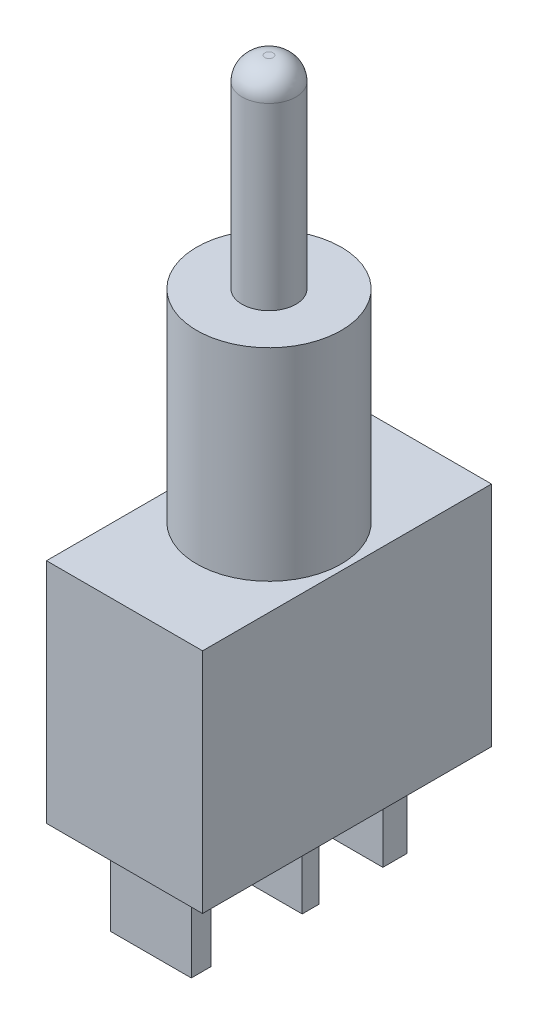
ISO-10303-21;
HEADER;
FILE_DESCRIPTION(('STEP AP214'),'2;1');
FILE_NAME('part.step','',(''),(''),'','','');
FILE_SCHEMA(('AUTOMOTIVE_DESIGN { 1 0 10303 214 1 1 1 1 }'));
ENDSEC;
DATA;
#1=APPLICATION_CONTEXT('core data for automotive mechanical design processes');
#2=APPLICATION_PROTOCOL_DEFINITION('international standard','automotive_design',2000,#1);
#3=PRODUCT_CONTEXT('',#1,'mechanical');
#4=PRODUCT('Part','Part','',(#3));
#5=PRODUCT_RELATED_PRODUCT_CATEGORY('part','',(#4));
#6=PRODUCT_DEFINITION_FORMATION('','',#4);
#7=PRODUCT_DEFINITION_CONTEXT('part definition',#1,'design');
#8=PRODUCT_DEFINITION('design','',#6,#7);
#9=PRODUCT_DEFINITION_SHAPE('','',#8);
#10=(LENGTH_UNIT() NAMED_UNIT(*) SI_UNIT(.MILLI.,.METRE.));
#11=(NAMED_UNIT(*) PLANE_ANGLE_UNIT() SI_UNIT($,.RADIAN.));
#12=(NAMED_UNIT(*) SI_UNIT($,.STERADIAN.) SOLID_ANGLE_UNIT());
#13=UNCERTAINTY_MEASURE_WITH_UNIT(LENGTH_MEASURE(1.E-05),#10,'distance_accuracy_value','');
#14=(GEOMETRIC_REPRESENTATION_CONTEXT(3) GLOBAL_UNCERTAINTY_ASSIGNED_CONTEXT((#13)) GLOBAL_UNIT_ASSIGNED_CONTEXT((#10,
#11,#12)) REPRESENTATION_CONTEXT('',''));
#15=CARTESIAN_POINT('',(0.,0.,0.));
#16=DIRECTION('',(0.,0.,1.));
#17=DIRECTION('',(1.,0.,0.));
#18=AXIS2_PLACEMENT_3D('',#15,#16,#17);
#19=CARTESIAN_POINT('',(0.,0.,0.));
#20=DIRECTION('',(0.,-1.,0.));
#21=DIRECTION('',(0.,0.,-1.));
#22=AXIS2_PLACEMENT_3D('',#19,#20,#21);
#23=PLANE('',#22);
#24=DIRECTION('',(0.,0.,1.));
#25=VECTOR('',#24,1.);
#26=CARTESIAN_POINT('',(0.,0.,0.));
#27=LINE('',#26,#25);
#28=CARTESIAN_POINT('',(0.,0.,-12.7));
#29=VERTEX_POINT('',#28);
#30=CARTESIAN_POINT('',(0.,0.,0.));
#31=VERTEX_POINT('',#30);
#32=EDGE_CURVE('E232',#29,#31,#27,.T.);
#33=ORIENTED_EDGE('',*,*,#32,.F.);
#34=DIRECTION('',(-1.,0.,0.));
#35=VECTOR('',#34,1.);
#36=CARTESIAN_POINT('',(0.,0.,-12.7));
#37=LINE('',#36,#35);
#38=CARTESIAN_POINT('',(6.86,0.,-12.7));
#39=VERTEX_POINT('',#38);
#40=EDGE_CURVE('E237',#39,#29,#37,.T.);
#41=ORIENTED_EDGE('',*,*,#40,.F.);
#42=DIRECTION('',(0.,0.,-1.));
#43=VECTOR('',#42,1.);
#44=CARTESIAN_POINT('',(6.86,0.,0.));
#45=LINE('',#44,#43);
#46=CARTESIAN_POINT('',(6.86,0.,0.));
#47=VERTEX_POINT('',#46);
#48=EDGE_CURVE('E248',#47,#39,#45,.T.);
#49=ORIENTED_EDGE('',*,*,#48,.F.);
#50=DIRECTION('',(1.,0.,0.));
#51=VECTOR('',#50,1.);
#52=CARTESIAN_POINT('',(0.,0.,0.));
#53=LINE('',#52,#51);
#54=EDGE_CURVE('E246',#31,#47,#53,.T.);
#55=ORIENTED_EDGE('',*,*,#54,.F.);
#56=EDGE_LOOP('',(#33,#41,#49,#55));
#57=FACE_BOUND('',#56,.T.);
#58=DIRECTION('',(1.,0.,0.));
#59=VECTOR('',#58,1.);
#60=CARTESIAN_POINT('',(1.51842921939957,0.,-6.90562990689449));
#61=LINE('',#60,#59);
#62=CARTESIAN_POINT('',(1.51842921939957,0.,-6.90562990689449));
#63=VERTEX_POINT('',#62);
#64=CARTESIAN_POINT('',(5.06630458819397,0.,-6.90562990689449));
#65=VERTEX_POINT('',#64);
#66=EDGE_CURVE('E217',#63,#65,#61,.T.);
#67=ORIENTED_EDGE('',*,*,#66,.F.);
#68=DIRECTION('',(0.,0.,-1.));
#69=VECTOR('',#68,1.);
#70=CARTESIAN_POINT('',(1.51842921939957,0.,-6.17158672714393));
#71=LINE('',#70,#69);
#72=CARTESIAN_POINT('',(1.51842921939957,0.,-6.17158672714393));
#73=VERTEX_POINT('',#72);
#74=EDGE_CURVE('E203',#73,#63,#71,.T.);
#75=ORIENTED_EDGE('',*,*,#74,.F.);
#76=DIRECTION('',(-1.,0.,0.));
#77=VECTOR('',#76,1.);
#78=CARTESIAN_POINT('',(1.51842921939957,0.,-6.17158672714393));
#79=LINE('',#78,#77);
#80=CARTESIAN_POINT('',(5.06630458819397,0.,-6.17158672714393));
#81=VERTEX_POINT('',#80);
#82=EDGE_CURVE('E208',#81,#73,#79,.T.);
#83=ORIENTED_EDGE('',*,*,#82,.F.);
#84=DIRECTION('',(0.,0.,1.));
#85=VECTOR('',#84,1.);
#86=CARTESIAN_POINT('',(5.06630458819397,0.,-6.17158672714393));
#87=LINE('',#86,#85);
#88=EDGE_CURVE('E219',#65,#81,#87,.T.);
#89=ORIENTED_EDGE('',*,*,#88,.F.);
#90=EDGE_LOOP('',(#67,#75,#83,#89));
#91=FACE_BOUND('',#90,.T.);
#92=DIRECTION('',(1.,0.,0.));
#93=VECTOR('',#92,1.);
#94=CARTESIAN_POINT('',(1.51842921939957,0.,-2.17512941516863));
#95=LINE('',#94,#93);
#96=CARTESIAN_POINT('',(1.51842921939957,0.,-2.17512941516863));
#97=VERTEX_POINT('',#96);
#98=CARTESIAN_POINT('',(5.06630458819397,0.,-2.17512941516863));
#99=VERTEX_POINT('',#98);
#100=EDGE_CURVE('E175',#97,#99,#95,.T.);
#101=ORIENTED_EDGE('',*,*,#100,.F.);
#102=DIRECTION('',(0.,0.,-1.));
#103=VECTOR('',#102,1.);
#104=CARTESIAN_POINT('',(1.51842921939957,0.,-1.29835561713323));
#105=LINE('',#104,#103);
#106=CARTESIAN_POINT('',(1.51842921939957,0.,-1.29835561713323));
#107=VERTEX_POINT('',#106);
#108=EDGE_CURVE('E172',#107,#97,#105,.T.);
#109=ORIENTED_EDGE('',*,*,#108,.F.);
#110=DIRECTION('',(-1.,0.,0.));
#111=VECTOR('',#110,1.);
#112=CARTESIAN_POINT('',(1.51842921939957,0.,-1.29835561713323));
#113=LINE('',#112,#111);
#114=CARTESIAN_POINT('',(5.06630458819397,0.,-1.29835561713323));
#115=VERTEX_POINT('',#114);
#116=EDGE_CURVE('E184',#115,#107,#113,.T.);
#117=ORIENTED_EDGE('',*,*,#116,.F.);
#118=DIRECTION('',(0.,0.,1.));
#119=VECTOR('',#118,1.);
#120=CARTESIAN_POINT('',(5.06630458819397,0.,-1.29835561713323));
#121=LINE('',#120,#119);
#122=EDGE_CURVE('E192',#99,#115,#121,.T.);
#123=ORIENTED_EDGE('',*,*,#122,.F.);
#124=EDGE_LOOP('',(#101,#109,#117,#123));
#125=FACE_BOUND('',#124,.T.);
#126=DIRECTION('',(1.,0.,0.));
#127=VECTOR('',#126,1.);
#128=CARTESIAN_POINT('',(1.51842921939957,0.,-10.7695516447482));
#129=LINE('',#128,#127);
#130=CARTESIAN_POINT('',(1.51842921939957,0.,-10.7695516447482));
#131=VERTEX_POINT('',#130);
#132=CARTESIAN_POINT('',(5.06630458819397,0.,-10.7695516447482));
#133=VERTEX_POINT('',#132);
#134=EDGE_CURVE('E406',#131,#133,#129,.T.);
#135=ORIENTED_EDGE('',*,*,#134,.F.);
#136=DIRECTION('',(0.,0.,-1.));
#137=VECTOR('',#136,1.);
#138=CARTESIAN_POINT('',(1.51842921939957,0.,-9.71946209593832));
#139=LINE('',#138,#137);
#140=CARTESIAN_POINT('',(1.51842921939957,0.,-9.71946209593832));
#141=VERTEX_POINT('',#140);
#142=EDGE_CURVE('E170',#141,#131,#139,.T.);
#143=ORIENTED_EDGE('',*,*,#142,.F.);
#144=DIRECTION('',(-1.,0.,0.));
#145=VECTOR('',#144,1.);
#146=CARTESIAN_POINT('',(1.51842921939957,0.,-9.71946209593832));
#147=LINE('',#146,#145);
#148=CARTESIAN_POINT('',(5.06630458819397,0.,-9.71946209593832));
#149=VERTEX_POINT('',#148);
#150=EDGE_CURVE('E166',#149,#141,#147,.T.);
#151=ORIENTED_EDGE('',*,*,#150,.F.);
#152=DIRECTION('',(0.,0.,1.));
#153=VECTOR('',#152,1.);
#154=CARTESIAN_POINT('',(5.06630458819397,0.,-9.71946209593832));
#155=LINE('',#154,#153);
#156=EDGE_CURVE('E408',#133,#149,#155,.T.);
#157=ORIENTED_EDGE('',*,*,#156,.F.);
#158=EDGE_LOOP('',(#135,#143,#151,#157));
#159=FACE_BOUND('',#158,.T.);
#160=ADVANCED_FACE('F33',(#57,#91,#125,#159),#23,.T.);
#161=CARTESIAN_POINT('',(0.,10.,0.));
#162=DIRECTION('',(1.,0.,0.));
#163=DIRECTION('',(0.,0.,-1.));
#164=AXIS2_PLACEMENT_3D('',#161,#162,#163);
#165=PLANE('',#164);
#166=ORIENTED_EDGE('',*,*,#32,.T.);
#167=DIRECTION('',(0.,-1.,0.));
#168=VECTOR('',#167,1.);
#169=CARTESIAN_POINT('',(0.,10.,0.));
#170=LINE('',#169,#168);
#171=CARTESIAN_POINT('',(0.,10.,0.));
#172=VERTEX_POINT('',#171);
#173=EDGE_CURVE('E259',#172,#31,#170,.T.);
#174=ORIENTED_EDGE('',*,*,#173,.F.);
#175=DIRECTION('',(0.,0.,1.));
#176=VECTOR('',#175,1.);
#177=CARTESIAN_POINT('',(0.,10.,0.));
#178=LINE('',#177,#176);
#179=CARTESIAN_POINT('',(0.,10.,-12.7));
#180=VERTEX_POINT('',#179);
#181=EDGE_CURVE('E233',#180,#172,#178,.T.);
#182=ORIENTED_EDGE('',*,*,#181,.F.);
#183=DIRECTION('',(0.,-1.,0.));
#184=VECTOR('',#183,1.);
#185=CARTESIAN_POINT('',(0.,10.,-12.7));
#186=LINE('',#185,#184);
#187=EDGE_CURVE('E243',#180,#29,#186,.T.);
#188=ORIENTED_EDGE('',*,*,#187,.T.);
#189=EDGE_LOOP('',(#166,#174,#182,#188));
#190=FACE_BOUND('',#189,.T.);
#191=ADVANCED_FACE('F278',(#190),#165,.F.);
#192=CARTESIAN_POINT('',(0.,10.,0.));
#193=DIRECTION('',(0.,0.,-1.));
#194=DIRECTION('',(-1.,0.,0.));
#195=AXIS2_PLACEMENT_3D('',#192,#193,#194);
#196=PLANE('',#195);
#197=ORIENTED_EDGE('',*,*,#54,.T.);
#198=DIRECTION('',(0.,-1.,0.));
#199=VECTOR('',#198,1.);
#200=CARTESIAN_POINT('',(6.86,10.,0.));
#201=LINE('',#200,#199);
#202=CARTESIAN_POINT('',(6.86,10.,0.));
#203=VERTEX_POINT('',#202);
#204=EDGE_CURVE('E256',#203,#47,#201,.T.);
#205=ORIENTED_EDGE('',*,*,#204,.F.);
#206=DIRECTION('',(1.,0.,0.));
#207=VECTOR('',#206,1.);
#208=CARTESIAN_POINT('',(0.,10.,0.));
#209=LINE('',#208,#207);
#210=EDGE_CURVE('E236',#172,#203,#209,.T.);
#211=ORIENTED_EDGE('',*,*,#210,.F.);
#212=ORIENTED_EDGE('',*,*,#173,.T.);
#213=EDGE_LOOP('',(#197,#205,#211,#212));
#214=FACE_BOUND('',#213,.T.);
#215=ADVANCED_FACE('F286',(#214),#196,.F.);
#216=CARTESIAN_POINT('',(6.86,10.,0.));
#217=DIRECTION('',(-1.,0.,0.));
#218=DIRECTION('',(0.,0.,1.));
#219=AXIS2_PLACEMENT_3D('',#216,#217,#218);
#220=PLANE('',#219);
#221=ORIENTED_EDGE('',*,*,#48,.T.);
#222=DIRECTION('',(0.,-1.,0.));
#223=VECTOR('',#222,1.);
#224=CARTESIAN_POINT('',(6.86,10.,-12.7));
#225=LINE('',#224,#223);
#226=CARTESIAN_POINT('',(6.86,10.,-12.7));
#227=VERTEX_POINT('',#226);
#228=EDGE_CURVE('E253',#227,#39,#225,.T.);
#229=ORIENTED_EDGE('',*,*,#228,.F.);
#230=DIRECTION('',(0.,0.,-1.));
#231=VECTOR('',#230,1.);
#232=CARTESIAN_POINT('',(6.86,10.,0.));
#233=LINE('',#232,#231);
#234=EDGE_CURVE('E239',#203,#227,#233,.T.);
#235=ORIENTED_EDGE('',*,*,#234,.F.);
#236=ORIENTED_EDGE('',*,*,#204,.T.);
#237=EDGE_LOOP('',(#221,#229,#235,#236));
#238=FACE_BOUND('',#237,.T.);
#239=ADVANCED_FACE('F297',(#238),#220,.F.);
#240=CARTESIAN_POINT('',(0.,10.,-12.7));
#241=DIRECTION('',(0.,0.,1.));
#242=DIRECTION('',(1.,0.,0.));
#243=AXIS2_PLACEMENT_3D('',#240,#241,#242);
#244=PLANE('',#243);
#245=ORIENTED_EDGE('',*,*,#40,.T.);
#246=ORIENTED_EDGE('',*,*,#187,.F.);
#247=DIRECTION('',(-1.,0.,0.));
#248=VECTOR('',#247,1.);
#249=CARTESIAN_POINT('',(0.,10.,-12.7));
#250=LINE('',#249,#248);
#251=EDGE_CURVE('E241',#227,#180,#250,.T.);
#252=ORIENTED_EDGE('',*,*,#251,.F.);
#253=ORIENTED_EDGE('',*,*,#228,.T.);
#254=EDGE_LOOP('',(#245,#246,#252,#253));
#255=FACE_BOUND('',#254,.T.);
#256=ADVANCED_FACE('F294',(#255),#244,.F.);
#257=CARTESIAN_POINT('',(0.,10.,0.));
#258=DIRECTION('',(0.,-1.,0.));
#259=DIRECTION('',(0.,0.,-1.));
#260=AXIS2_PLACEMENT_3D('',#257,#258,#259);
#261=PLANE('',#260);
#262=CARTESIAN_POINT('',(3.43,10.,-6.35));
#263=DIRECTION('',(0.,-1.,0.));
#264=DIRECTION('',(0.,0.,-1.));
#265=AXIS2_PLACEMENT_3D('',#262,#263,#264);
#266=CIRCLE('',#265,3.175);
#267=CARTESIAN_POINT('',(3.43,10.,-9.525));
#268=VERTEX_POINT('',#267);
#269=EDGE_CURVE('E262',#268,#268,#266,.F.);
#270=ORIENTED_EDGE('',*,*,#269,.F.);
#271=EDGE_LOOP('',(#270));
#272=FACE_BOUND('',#271,.T.);
#273=ORIENTED_EDGE('',*,*,#181,.T.);
#274=ORIENTED_EDGE('',*,*,#210,.T.);
#275=ORIENTED_EDGE('',*,*,#234,.T.);
#276=ORIENTED_EDGE('',*,*,#251,.T.);
#277=EDGE_LOOP('',(#273,#274,#275,#276));
#278=FACE_BOUND('',#277,.T.);
#279=ADVANCED_FACE('F292',(#272,#278),#261,.F.);
#280=CARTESIAN_POINT('',(1.51842921939957,-4.,-6.17158672714393));
#281=DIRECTION('',(1.,0.,0.));
#282=DIRECTION('',(0.,0.,-1.));
#283=AXIS2_PLACEMENT_3D('',#280,#281,#282);
#284=PLANE('',#283);
#285=ORIENTED_EDGE('',*,*,#74,.T.);
#286=DIRECTION('',(0.,1.,0.));
#287=VECTOR('',#286,1.);
#288=CARTESIAN_POINT('',(1.51842921939957,-4.,-6.90562990689449));
#289=LINE('',#288,#287);
#290=CARTESIAN_POINT('',(1.51842921939957,-4.,-6.90562990689449));
#291=VERTEX_POINT('',#290);
#292=EDGE_CURVE('E230',#291,#63,#289,.T.);
#293=ORIENTED_EDGE('',*,*,#292,.F.);
#294=DIRECTION('',(0.,0.,-1.));
#295=VECTOR('',#294,1.);
#296=CARTESIAN_POINT('',(1.51842921939957,-4.,-6.17158672714393));
#297=LINE('',#296,#295);
#298=CARTESIAN_POINT('',(1.51842921939957,-4.,-6.17158672714393));
#299=VERTEX_POINT('',#298);
#300=EDGE_CURVE('E204',#299,#291,#297,.T.);
#301=ORIENTED_EDGE('',*,*,#300,.F.);
#302=DIRECTION('',(0.,1.,0.));
#303=VECTOR('',#302,1.);
#304=CARTESIAN_POINT('',(1.51842921939957,-4.,-6.17158672714393));
#305=LINE('',#304,#303);
#306=EDGE_CURVE('E214',#299,#73,#305,.T.);
#307=ORIENTED_EDGE('',*,*,#306,.T.);
#308=EDGE_LOOP('',(#285,#293,#301,#307));
#309=FACE_BOUND('',#308,.T.);
#310=ADVANCED_FACE('F317',(#309),#284,.F.);
#311=CARTESIAN_POINT('',(1.51842921939957,-4.,-6.90562990689449));
#312=DIRECTION('',(0.,0.,1.));
#313=DIRECTION('',(1.,0.,0.));
#314=AXIS2_PLACEMENT_3D('',#311,#312,#313);
#315=PLANE('',#314);
#316=ORIENTED_EDGE('',*,*,#66,.T.);
#317=DIRECTION('',(0.,1.,0.));
#318=VECTOR('',#317,1.);
#319=CARTESIAN_POINT('',(5.06630458819397,-4.,-6.90562990689449));
#320=LINE('',#319,#318);
#321=CARTESIAN_POINT('',(5.06630458819397,-4.,-6.90562990689449));
#322=VERTEX_POINT('',#321);
#323=EDGE_CURVE('E227',#322,#65,#320,.T.);
#324=ORIENTED_EDGE('',*,*,#323,.F.);
#325=DIRECTION('',(1.,0.,0.));
#326=VECTOR('',#325,1.);
#327=CARTESIAN_POINT('',(1.51842921939957,-4.,-6.90562990689449));
#328=LINE('',#327,#326);
#329=EDGE_CURVE('E207',#291,#322,#328,.T.);
#330=ORIENTED_EDGE('',*,*,#329,.F.);
#331=ORIENTED_EDGE('',*,*,#292,.T.);
#332=EDGE_LOOP('',(#316,#324,#330,#331));
#333=FACE_BOUND('',#332,.T.);
#334=ADVANCED_FACE('F324',(#333),#315,.F.);
#335=CARTESIAN_POINT('',(5.06630458819397,-4.,-6.17158672714393));
#336=DIRECTION('',(-1.,0.,0.));
#337=DIRECTION('',(0.,0.,1.));
#338=AXIS2_PLACEMENT_3D('',#335,#336,#337);
#339=PLANE('',#338);
#340=ORIENTED_EDGE('',*,*,#88,.T.);
#341=DIRECTION('',(0.,1.,0.));
#342=VECTOR('',#341,1.);
#343=CARTESIAN_POINT('',(5.06630458819397,-4.,-6.17158672714393));
#344=LINE('',#343,#342);
#345=CARTESIAN_POINT('',(5.06630458819397,-4.,-6.17158672714393));
#346=VERTEX_POINT('',#345);
#347=EDGE_CURVE('E225',#346,#81,#344,.T.);
#348=ORIENTED_EDGE('',*,*,#347,.F.);
#349=DIRECTION('',(0.,0.,1.));
#350=VECTOR('',#349,1.);
#351=CARTESIAN_POINT('',(5.06630458819397,-4.,-6.17158672714393));
#352=LINE('',#351,#350);
#353=EDGE_CURVE('E210',#322,#346,#352,.T.);
#354=ORIENTED_EDGE('',*,*,#353,.F.);
#355=ORIENTED_EDGE('',*,*,#323,.T.);
#356=EDGE_LOOP('',(#340,#348,#354,#355));
#357=FACE_BOUND('',#356,.T.);
#358=ADVANCED_FACE('F380',(#357),#339,.F.);
#359=CARTESIAN_POINT('',(1.51842921939957,-4.,-6.17158672714393));
#360=DIRECTION('',(0.,0.,-1.));
#361=DIRECTION('',(-1.,0.,0.));
#362=AXIS2_PLACEMENT_3D('',#359,#360,#361);
#363=PLANE('',#362);
#364=ORIENTED_EDGE('',*,*,#82,.T.);
#365=ORIENTED_EDGE('',*,*,#306,.F.);
#366=DIRECTION('',(-1.,0.,0.));
#367=VECTOR('',#366,1.);
#368=CARTESIAN_POINT('',(1.51842921939957,-4.,-6.17158672714393));
#369=LINE('',#368,#367);
#370=EDGE_CURVE('E212',#346,#299,#369,.T.);
#371=ORIENTED_EDGE('',*,*,#370,.F.);
#372=ORIENTED_EDGE('',*,*,#347,.T.);
#373=EDGE_LOOP('',(#364,#365,#371,#372));
#374=FACE_BOUND('',#373,.T.);
#375=ADVANCED_FACE('F376',(#374),#363,.F.);
#376=CARTESIAN_POINT('',(0.,-4.,0.));
#377=DIRECTION('',(0.,-1.,0.));
#378=DIRECTION('',(0.,0.,-1.));
#379=AXIS2_PLACEMENT_3D('',#376,#377,#378);
#380=PLANE('',#379);
#381=ORIENTED_EDGE('',*,*,#300,.T.);
#382=ORIENTED_EDGE('',*,*,#329,.T.);
#383=ORIENTED_EDGE('',*,*,#353,.T.);
#384=ORIENTED_EDGE('',*,*,#370,.T.);
#385=EDGE_LOOP('',(#381,#382,#383,#384));
#386=FACE_BOUND('',#385,.T.);
#387=ADVANCED_FACE('F372',(#386),#380,.T.);
#388=CARTESIAN_POINT('',(1.51842921939957,-4.,-1.29835561713323));
#389=DIRECTION('',(1.,0.,0.));
#390=DIRECTION('',(0.,0.,-1.));
#391=AXIS2_PLACEMENT_3D('',#388,#389,#390);
#392=PLANE('',#391);
#393=ORIENTED_EDGE('',*,*,#108,.T.);
#394=DIRECTION('',(0.,1.,0.));
#395=VECTOR('',#394,1.);
#396=CARTESIAN_POINT('',(1.51842921939957,-4.,-2.17512941516863));
#397=LINE('',#396,#395);
#398=CARTESIAN_POINT('',(1.51842921939957,-4.,-2.17512941516863));
#399=VERTEX_POINT('',#398);
#400=EDGE_CURVE('E201',#399,#97,#397,.T.);
#401=ORIENTED_EDGE('',*,*,#400,.F.);
#402=DIRECTION('',(0.,0.,-1.));
#403=VECTOR('',#402,1.);
#404=CARTESIAN_POINT('',(1.51842921939957,-4.,-1.29835561713323));
#405=LINE('',#404,#403);
#406=CARTESIAN_POINT('',(1.51842921939957,-4.,-1.29835561713323));
#407=VERTEX_POINT('',#406);
#408=EDGE_CURVE('E180',#407,#399,#405,.T.);
#409=ORIENTED_EDGE('',*,*,#408,.F.);
#410=DIRECTION('',(0.,1.,0.));
#411=VECTOR('',#410,1.);
#412=CARTESIAN_POINT('',(1.51842921939957,-4.,-1.29835561713323));
#413=LINE('',#412,#411);
#414=EDGE_CURVE('E189',#407,#107,#413,.T.);
#415=ORIENTED_EDGE('',*,*,#414,.T.);
#416=EDGE_LOOP('',(#393,#401,#409,#415));
#417=FACE_BOUND('',#416,.T.);
#418=ADVANCED_FACE('F368',(#417),#392,.F.);
#419=CARTESIAN_POINT('',(1.51842921939957,-4.,-2.17512941516863));
#420=DIRECTION('',(0.,0.,1.));
#421=DIRECTION('',(1.,0.,0.));
#422=AXIS2_PLACEMENT_3D('',#419,#420,#421);
#423=PLANE('',#422);
#424=ORIENTED_EDGE('',*,*,#100,.T.);
#425=DIRECTION('',(0.,1.,0.));
#426=VECTOR('',#425,1.);
#427=CARTESIAN_POINT('',(5.06630458819397,-4.,-2.17512941516863));
#428=LINE('',#427,#426);
#429=CARTESIAN_POINT('',(5.06630458819397,-4.,-2.17512941516863));
#430=VERTEX_POINT('',#429);
#431=EDGE_CURVE('E198',#430,#99,#428,.T.);
#432=ORIENTED_EDGE('',*,*,#431,.F.);
#433=DIRECTION('',(1.,0.,0.));
#434=VECTOR('',#433,1.);
#435=CARTESIAN_POINT('',(1.51842921939957,-4.,-2.17512941516863));
#436=LINE('',#435,#434);
#437=EDGE_CURVE('E183',#399,#430,#436,.T.);
#438=ORIENTED_EDGE('',*,*,#437,.F.);
#439=ORIENTED_EDGE('',*,*,#400,.T.);
#440=EDGE_LOOP('',(#424,#432,#438,#439));
#441=FACE_BOUND('',#440,.T.);
#442=ADVANCED_FACE('F364',(#441),#423,.F.);
#443=CARTESIAN_POINT('',(5.06630458819397,-4.,-1.29835561713323));
#444=DIRECTION('',(-1.,0.,0.));
#445=DIRECTION('',(0.,0.,1.));
#446=AXIS2_PLACEMENT_3D('',#443,#444,#445);
#447=PLANE('',#446);
#448=ORIENTED_EDGE('',*,*,#122,.T.);
#449=DIRECTION('',(0.,1.,0.));
#450=VECTOR('',#449,1.);
#451=CARTESIAN_POINT('',(5.06630458819397,-4.,-1.29835561713323));
#452=LINE('',#451,#450);
#453=CARTESIAN_POINT('',(5.06630458819397,-4.,-1.29835561713323));
#454=VERTEX_POINT('',#453);
#455=EDGE_CURVE('E56',#454,#115,#452,.T.);
#456=ORIENTED_EDGE('',*,*,#455,.F.);
#457=DIRECTION('',(0.,0.,1.));
#458=VECTOR('',#457,1.);
#459=CARTESIAN_POINT('',(5.06630458819397,-4.,-1.29835561713323));
#460=LINE('',#459,#458);
#461=EDGE_CURVE('E186',#430,#454,#460,.T.);
#462=ORIENTED_EDGE('',*,*,#461,.F.);
#463=ORIENTED_EDGE('',*,*,#431,.T.);
#464=EDGE_LOOP('',(#448,#456,#462,#463));
#465=FACE_BOUND('',#464,.T.);
#466=ADVANCED_FACE('F361',(#465),#447,.F.);
#467=CARTESIAN_POINT('',(1.51842921939957,-4.,-1.29835561713323));
#468=DIRECTION('',(0.,0.,-1.));
#469=DIRECTION('',(-1.,0.,0.));
#470=AXIS2_PLACEMENT_3D('',#467,#468,#469);
#471=PLANE('',#470);
#472=ORIENTED_EDGE('',*,*,#116,.T.);
#473=ORIENTED_EDGE('',*,*,#414,.F.);
#474=DIRECTION('',(-1.,0.,0.));
#475=VECTOR('',#474,1.);
#476=CARTESIAN_POINT('',(1.51842921939957,-4.,-1.29835561713323));
#477=LINE('',#476,#475);
#478=EDGE_CURVE('E188',#454,#407,#477,.T.);
#479=ORIENTED_EDGE('',*,*,#478,.F.);
#480=ORIENTED_EDGE('',*,*,#455,.T.);
#481=EDGE_LOOP('',(#472,#473,#479,#480));
#482=FACE_BOUND('',#481,.T.);
#483=ADVANCED_FACE('F357',(#482),#471,.F.);
#484=CARTESIAN_POINT('',(0.,-4.,0.));
#485=DIRECTION('',(0.,-1.,0.));
#486=DIRECTION('',(0.,0.,-1.));
#487=AXIS2_PLACEMENT_3D('',#484,#485,#486);
#488=PLANE('',#487);
#489=ORIENTED_EDGE('',*,*,#408,.T.);
#490=ORIENTED_EDGE('',*,*,#437,.T.);
#491=ORIENTED_EDGE('',*,*,#461,.T.);
#492=ORIENTED_EDGE('',*,*,#478,.T.);
#493=EDGE_LOOP('',(#489,#490,#491,#492));
#494=FACE_BOUND('',#493,.T.);
#495=ADVANCED_FACE('F354',(#494),#488,.T.);
#496=CARTESIAN_POINT('',(1.51842921939957,-4.,-9.71946209593832));
#497=DIRECTION('',(1.,0.,0.));
#498=DIRECTION('',(0.,0.,-1.));
#499=AXIS2_PLACEMENT_3D('',#496,#497,#498);
#500=PLANE('',#499);
#501=ORIENTED_EDGE('',*,*,#142,.T.);
#502=DIRECTION('',(0.,1.,0.));
#503=VECTOR('',#502,1.);
#504=CARTESIAN_POINT('',(1.51842921939957,-4.,-10.7695516447482));
#505=LINE('',#504,#503);
#506=CARTESIAN_POINT('',(1.51842921939957,-4.,-10.7695516447482));
#507=VERTEX_POINT('',#506);
#508=EDGE_CURVE('E151',#507,#131,#505,.T.);
#509=ORIENTED_EDGE('',*,*,#508,.F.);
#510=DIRECTION('',(0.,0.,-1.));
#511=VECTOR('',#510,1.);
#512=CARTESIAN_POINT('',(1.51842921939957,-4.,-9.71946209593832));
#513=LINE('',#512,#511);
#514=CARTESIAN_POINT('',(1.51842921939957,-4.,-9.71946209593832));
#515=VERTEX_POINT('',#514);
#516=EDGE_CURVE('E158',#515,#507,#513,.T.);
#517=ORIENTED_EDGE('',*,*,#516,.F.);
#518=DIRECTION('',(0.,1.,0.));
#519=VECTOR('',#518,1.);
#520=CARTESIAN_POINT('',(1.51842921939957,-4.,-9.71946209593832));
#521=LINE('',#520,#519);
#522=EDGE_CURVE('E416',#515,#141,#521,.T.);
#523=ORIENTED_EDGE('',*,*,#522,.T.);
#524=EDGE_LOOP('',(#501,#509,#517,#523));
#525=FACE_BOUND('',#524,.T.);
#526=ADVANCED_FACE('F168',(#525),#500,.F.);
#527=CARTESIAN_POINT('',(1.51842921939957,-4.,-10.7695516447482));
#528=DIRECTION('',(0.,0.,1.));
#529=DIRECTION('',(1.,0.,0.));
#530=AXIS2_PLACEMENT_3D('',#527,#528,#529);
#531=PLANE('',#530);
#532=ORIENTED_EDGE('',*,*,#134,.T.);
#533=DIRECTION('',(0.,1.,0.));
#534=VECTOR('',#533,1.);
#535=CARTESIAN_POINT('',(5.06630458819397,-4.,-10.7695516447482));
#536=LINE('',#535,#534);
#537=CARTESIAN_POINT('',(5.06630458819397,-4.,-10.7695516447482));
#538=VERTEX_POINT('',#537);
#539=EDGE_CURVE('E154',#538,#133,#536,.T.);
#540=ORIENTED_EDGE('',*,*,#539,.F.);
#541=DIRECTION('',(1.,0.,0.));
#542=VECTOR('',#541,1.);
#543=CARTESIAN_POINT('',(1.51842921939957,-4.,-10.7695516447482));
#544=LINE('',#543,#542);
#545=EDGE_CURVE('E147',#507,#538,#544,.T.);
#546=ORIENTED_EDGE('',*,*,#545,.F.);
#547=ORIENTED_EDGE('',*,*,#508,.T.);
#548=EDGE_LOOP('',(#532,#540,#546,#547));
#549=FACE_BOUND('',#548,.T.);
#550=ADVANCED_FACE('F149',(#549),#531,.F.);
#551=CARTESIAN_POINT('',(5.06630458819397,-4.,-9.71946209593832));
#552=DIRECTION('',(-1.,0.,0.));
#553=DIRECTION('',(0.,0.,1.));
#554=AXIS2_PLACEMENT_3D('',#551,#552,#553);
#555=PLANE('',#554);
#556=ORIENTED_EDGE('',*,*,#156,.T.);
#557=DIRECTION('',(0.,1.,0.));
#558=VECTOR('',#557,1.);
#559=CARTESIAN_POINT('',(5.06630458819397,-4.,-9.71946209593832));
#560=LINE('',#559,#558);
#561=CARTESIAN_POINT('',(5.06630458819397,-4.,-9.71946209593832));
#562=VERTEX_POINT('',#561);
#563=EDGE_CURVE('E48',#562,#149,#560,.T.);
#564=ORIENTED_EDGE('',*,*,#563,.F.);
#565=DIRECTION('',(0.,0.,1.));
#566=VECTOR('',#565,1.);
#567=CARTESIAN_POINT('',(5.06630458819397,-4.,-9.71946209593832));
#568=LINE('',#567,#566);
#569=EDGE_CURVE('E157',#538,#562,#568,.T.);
#570=ORIENTED_EDGE('',*,*,#569,.F.);
#571=ORIENTED_EDGE('',*,*,#539,.T.);
#572=EDGE_LOOP('',(#556,#564,#570,#571));
#573=FACE_BOUND('',#572,.T.);
#574=ADVANCED_FACE('F346',(#573),#555,.F.);
#575=CARTESIAN_POINT('',(1.51842921939957,-4.,-9.71946209593832));
#576=DIRECTION('',(0.,0.,-1.));
#577=DIRECTION('',(-1.,0.,0.));
#578=AXIS2_PLACEMENT_3D('',#575,#576,#577);
#579=PLANE('',#578);
#580=ORIENTED_EDGE('',*,*,#150,.T.);
#581=ORIENTED_EDGE('',*,*,#522,.F.);
#582=DIRECTION('',(-1.,0.,0.));
#583=VECTOR('',#582,1.);
#584=CARTESIAN_POINT('',(1.51842921939957,-4.,-9.71946209593832));
#585=LINE('',#584,#583);
#586=EDGE_CURVE('E162',#562,#515,#585,.T.);
#587=ORIENTED_EDGE('',*,*,#586,.F.);
#588=ORIENTED_EDGE('',*,*,#563,.T.);
#589=EDGE_LOOP('',(#580,#581,#587,#588));
#590=FACE_BOUND('',#589,.T.);
#591=ADVANCED_FACE('F339',(#590),#579,.F.);
#592=CARTESIAN_POINT('',(0.,-4.,0.));
#593=DIRECTION('',(0.,-1.,0.));
#594=DIRECTION('',(0.,0.,-1.));
#595=AXIS2_PLACEMENT_3D('',#592,#593,#594);
#596=PLANE('',#595);
#597=ORIENTED_EDGE('',*,*,#516,.T.);
#598=ORIENTED_EDGE('',*,*,#545,.T.);
#599=ORIENTED_EDGE('',*,*,#569,.T.);
#600=ORIENTED_EDGE('',*,*,#586,.T.);
#601=EDGE_LOOP('',(#597,#598,#599,#600));
#602=FACE_BOUND('',#601,.T.);
#603=ADVANCED_FACE('F161',(#602),#596,.T.);
#604=CARTESIAN_POINT('',(3.43,18.89,-6.35));
#605=DIRECTION('',(0.,-1.,0.));
#606=DIRECTION('',(0.,0.,-1.));
#607=AXIS2_PLACEMENT_3D('',#604,#605,#606);
#608=CYLINDRICAL_SURFACE('',#607,3.175);
#609=CARTESIAN_POINT('',(3.43,18.89,-6.35));
#610=DIRECTION('',(0.,1.,0.));
#611=DIRECTION('',(0.,0.,1.));
#612=AXIS2_PLACEMENT_3D('',#609,#610,#611);
#613=CIRCLE('',#612,3.175);
#614=CARTESIAN_POINT('',(3.43,18.89,-9.525));
#615=VERTEX_POINT('',#614);
#616=EDGE_CURVE('E411',#615,#615,#613,.T.);
#617=CARTESIAN_POINT('',(3.43,18.89,-9.525));
#618=CARTESIAN_POINT('',(3.43,18.7973958333333,-9.525));
#619=CARTESIAN_POINT('',(3.43,18.7047916666667,-9.525));
#620=CARTESIAN_POINT('',(3.43,18.5195833333333,-9.525));
#621=CARTESIAN_POINT('',(3.43,18.4269791666667,-9.525));
#622=CARTESIAN_POINT('',(3.43,18.2417708333333,-9.525));
#623=CARTESIAN_POINT('',(3.43,18.1491666666667,-9.525));
#624=CARTESIAN_POINT('',(3.43,17.9639583333333,-9.525));
#625=CARTESIAN_POINT('',(3.43,17.8713541666667,-9.525));
#626=CARTESIAN_POINT('',(3.43,17.6861458333333,-9.525));
#627=CARTESIAN_POINT('',(3.43,17.5935416666667,-9.525));
#628=CARTESIAN_POINT('',(3.43,17.4083333333333,-9.525));
#629=CARTESIAN_POINT('',(3.43,17.3157291666667,-9.525));
#630=CARTESIAN_POINT('',(3.43,17.1305208333333,-9.525));
#631=CARTESIAN_POINT('',(3.43,17.0379166666667,-9.525));
#632=CARTESIAN_POINT('',(3.43,16.8527083333333,-9.525));
#633=CARTESIAN_POINT('',(3.43,16.7601041666667,-9.525));
#634=CARTESIAN_POINT('',(3.43,16.5748958333333,-9.525));
#635=CARTESIAN_POINT('',(3.43,16.4822916666667,-9.525));
#636=CARTESIAN_POINT('',(3.43,16.2970833333333,-9.525));
#637=CARTESIAN_POINT('',(3.43,16.2044791666667,-9.525));
#638=CARTESIAN_POINT('',(3.43,16.0192708333333,-9.525));
#639=CARTESIAN_POINT('',(3.43,15.9266666666667,-9.525));
#640=CARTESIAN_POINT('',(3.43,15.7414583333333,-9.525));
#641=CARTESIAN_POINT('',(3.43,15.6488541666667,-9.525));
#642=CARTESIAN_POINT('',(3.43,15.4636458333333,-9.525));
#643=CARTESIAN_POINT('',(3.43,15.3710416666667,-9.525));
#644=CARTESIAN_POINT('',(3.43,15.1858333333333,-9.525));
#645=CARTESIAN_POINT('',(3.43,15.0932291666667,-9.525));
#646=CARTESIAN_POINT('',(3.43,14.9080208333333,-9.525));
#647=CARTESIAN_POINT('',(3.43,14.8154166666667,-9.525));
#648=CARTESIAN_POINT('',(3.43,14.6302083333333,-9.525));
#649=CARTESIAN_POINT('',(3.43,14.5376041666667,-9.525));
#650=CARTESIAN_POINT('',(3.43,14.3523958333333,-9.525));
#651=CARTESIAN_POINT('',(3.43,14.2597916666667,-9.525));
#652=CARTESIAN_POINT('',(3.43,14.0745833333333,-9.525));
#653=CARTESIAN_POINT('',(3.43,13.9819791666667,-9.525));
#654=CARTESIAN_POINT('',(3.43,13.7967708333333,-9.525));
#655=CARTESIAN_POINT('',(3.43,13.7041666666667,-9.525));
#656=CARTESIAN_POINT('',(3.43,13.5189583333333,-9.525));
#657=CARTESIAN_POINT('',(3.43,13.4263541666667,-9.525));
#658=CARTESIAN_POINT('',(3.43,13.2411458333333,-9.525));
#659=CARTESIAN_POINT('',(3.43,13.1485416666667,-9.525));
#660=CARTESIAN_POINT('',(3.43,12.9633333333333,-9.525));
#661=CARTESIAN_POINT('',(3.43,12.8707291666667,-9.525));
#662=CARTESIAN_POINT('',(3.43,12.6855208333333,-9.525));
#663=CARTESIAN_POINT('',(3.43,12.5929166666667,-9.525));
#664=CARTESIAN_POINT('',(3.43,12.4077083333333,-9.525));
#665=CARTESIAN_POINT('',(3.43,12.3151041666667,-9.525));
#666=CARTESIAN_POINT('',(3.43,12.1298958333333,-9.525));
#667=CARTESIAN_POINT('',(3.43,12.0372916666667,-9.525));
#668=CARTESIAN_POINT('',(3.43,11.8520833333333,-9.525));
#669=CARTESIAN_POINT('',(3.43,11.7594791666667,-9.525));
#670=CARTESIAN_POINT('',(3.43,11.5742708333333,-9.525));
#671=CARTESIAN_POINT('',(3.43,11.4816666666667,-9.525));
#672=CARTESIAN_POINT('',(3.43,11.2964583333333,-9.525));
#673=CARTESIAN_POINT('',(3.43,11.2038541666667,-9.525));
#674=CARTESIAN_POINT('',(3.43,11.0186458333333,-9.525));
#675=CARTESIAN_POINT('',(3.43,10.9260416666667,-9.525));
#676=CARTESIAN_POINT('',(3.43,10.7408333333333,-9.525));
#677=CARTESIAN_POINT('',(3.43,10.6482291666667,-9.525));
#678=CARTESIAN_POINT('',(3.43,10.4630208333333,-9.525));
#679=CARTESIAN_POINT('',(3.43,10.3704166666667,-9.525));
#680=CARTESIAN_POINT('',(3.43,10.1852083333333,-9.525));
#681=CARTESIAN_POINT('',(3.43,10.0926041666667,-9.525));
#682=CARTESIAN_POINT('',(3.43,10.,-9.525));
#683=B_SPLINE_CURVE_WITH_KNOTS('',3,(#617,#618,#619,#620,#621,#622,#623,#624,#625,#626,#627,
#628,#629,#630,#631,#632,#633,#634,#635,#636,#637,#638,#639,#640,#641,#642,#643,#644,#645,#646,
#647,#648,#649,#650,#651,#652,#653,#654,#655,#656,#657,#658,#659,#660,#661,#662,#663,#664,#665,
#666,#667,#668,#669,#670,#671,#672,#673,#674,#675,#676,#677,#678,#679,#680,#681,#682),
.UNSPECIFIED.,.F.,.F.,(4,2,2,2,2,2,2,2,2,2,2,2,2,2,2,2,2,2,2,2,2,2,2,2,2,2,2,2,2,2,2,2,4),(0.,
0.277812500000002,0.555625000000001,0.833437500000003,1.11125,1.3890625,1.666875,1.9446875,
2.2225,2.5003125,2.778125,3.0559375,3.33375,3.6115625,3.889375,4.1671875,4.445,4.7228125,
5.000625,5.2784375,5.55625,5.8340625,6.111875,6.3896875,6.6675,6.9453125,7.223125,7.5009375,
7.77875,8.0565625,8.334375,8.6121875,8.89),.UNSPECIFIED.);
#684=EDGE_CURVE('BSEAM328',#615,#268,#683,.T.);
#685=ORIENTED_EDGE('',*,*,#616,.F.);
#686=ORIENTED_EDGE('',*,*,#269,.T.);
#687=ORIENTED_EDGE('',*,*,#684,.T.);
#688=ORIENTED_EDGE('',*,*,#684,.F.);
#689=EDGE_LOOP('',(#685,#687,#686,#688));
#690=FACE_BOUND('',#689,.T.);
#691=ADVANCED_FACE('F328',(#690),#608,.T.);
#692=CARTESIAN_POINT('',(3.43,18.89,-6.35));
#693=DIRECTION('',(0.,1.,0.));
#694=DIRECTION('',(0.,0.,1.));
#695=AXIS2_PLACEMENT_3D('',#692,#693,#694);
#696=PLANE('',#695);
#697=CARTESIAN_POINT('',(3.43,18.89,-6.35));
#698=DIRECTION('',(0.,1.,0.));
#699=DIRECTION('',(0.,0.,1.));
#700=AXIS2_PLACEMENT_3D('',#697,#698,#699);
#701=CIRCLE('',#700,1.1822954958248);
#702=CARTESIAN_POINT('',(3.43,18.89,-7.5322954958248));
#703=VERTEX_POINT('',#702);
#704=EDGE_CURVE('E421',#703,#703,#701,.T.);
#705=ORIENTED_EDGE('',*,*,#704,.F.);
#706=EDGE_LOOP('',(#705));
#707=FACE_BOUND('',#706,.T.);
#708=ORIENTED_EDGE('',*,*,#616,.T.);
#709=EDGE_LOOP('',(#708));
#710=FACE_BOUND('',#709,.T.);
#711=ADVANCED_FACE('F330',(#707,#710),#696,.T.);
#712=CARTESIAN_POINT('',(3.43,27.78,-6.35));
#713=DIRECTION('',(0.,-1.,0.));
#714=DIRECTION('',(0.,0.,-1.));
#715=AXIS2_PLACEMENT_3D('',#712,#713,#714);
#716=CYLINDRICAL_SURFACE('',#715,1.1822954958248);
#717=CARTESIAN_POINT('',(3.43,26.78,-6.35));
#718=DIRECTION('',(0.,1.,0.));
#719=DIRECTION('',(0.,0.,1.));
#720=AXIS2_PLACEMENT_3D('',#717,#718,#719);
#721=CIRCLE('',#720,1.1822954958248);
#722=CARTESIAN_POINT('',(3.43,26.78,-7.5322954958248));
#723=VERTEX_POINT('',#722);
#724=EDGE_CURVE('E11',#723,#723,#721,.F.);
#725=CARTESIAN_POINT('',(3.43,26.78,-7.5322954958248));
#726=CARTESIAN_POINT('',(3.43,26.6978125,-7.5322954958248));
#727=CARTESIAN_POINT('',(3.43,26.615625,-7.5322954958248));
#728=CARTESIAN_POINT('',(3.43,26.45125,-7.5322954958248));
#729=CARTESIAN_POINT('',(3.43,26.3690625,-7.5322954958248));
#730=CARTESIAN_POINT('',(3.43,26.2046875,-7.5322954958248));
#731=CARTESIAN_POINT('',(3.43,26.1225,-7.5322954958248));
#732=CARTESIAN_POINT('',(3.43,25.958125,-7.5322954958248));
#733=CARTESIAN_POINT('',(3.43,25.8759375,-7.5322954958248));
#734=CARTESIAN_POINT('',(3.43,25.7115625,-7.5322954958248));
#735=CARTESIAN_POINT('',(3.43,25.629375,-7.5322954958248));
#736=CARTESIAN_POINT('',(3.43,25.465,-7.5322954958248));
#737=CARTESIAN_POINT('',(3.43,25.3828125,-7.5322954958248));
#738=CARTESIAN_POINT('',(3.43,25.2184375,-7.5322954958248));
#739=CARTESIAN_POINT('',(3.43,25.13625,-7.5322954958248));
#740=CARTESIAN_POINT('',(3.43,24.971875,-7.5322954958248));
#741=CARTESIAN_POINT('',(3.43,24.8896875,-7.5322954958248));
#742=CARTESIAN_POINT('',(3.43,24.7253125,-7.5322954958248));
#743=CARTESIAN_POINT('',(3.43,24.643125,-7.5322954958248));
#744=CARTESIAN_POINT('',(3.43,24.47875,-7.5322954958248));
#745=CARTESIAN_POINT('',(3.43,24.3965625,-7.5322954958248));
#746=CARTESIAN_POINT('',(3.43,24.2321875,-7.5322954958248));
#747=CARTESIAN_POINT('',(3.43,24.15,-7.5322954958248));
#748=CARTESIAN_POINT('',(3.43,23.985625,-7.5322954958248));
#749=CARTESIAN_POINT('',(3.43,23.9034375,-7.5322954958248));
#750=CARTESIAN_POINT('',(3.43,23.7390625,-7.5322954958248));
#751=CARTESIAN_POINT('',(3.43,23.656875,-7.5322954958248));
#752=CARTESIAN_POINT('',(3.43,23.4925,-7.5322954958248));
#753=CARTESIAN_POINT('',(3.43,23.4103125,-7.5322954958248));
#754=CARTESIAN_POINT('',(3.43,23.2459375,-7.5322954958248));
#755=CARTESIAN_POINT('',(3.43,23.16375,-7.5322954958248));
#756=CARTESIAN_POINT('',(3.43,22.999375,-7.5322954958248));
#757=CARTESIAN_POINT('',(3.43,22.9171875,-7.5322954958248));
#758=CARTESIAN_POINT('',(3.43,22.7528125,-7.5322954958248));
#759=CARTESIAN_POINT('',(3.43,22.670625,-7.5322954958248));
#760=CARTESIAN_POINT('',(3.43,22.50625,-7.5322954958248));
#761=CARTESIAN_POINT('',(3.43,22.4240625,-7.5322954958248));
#762=CARTESIAN_POINT('',(3.43,22.2596875,-7.5322954958248));
#763=CARTESIAN_POINT('',(3.43,22.1775,-7.5322954958248));
#764=CARTESIAN_POINT('',(3.43,22.013125,-7.5322954958248));
#765=CARTESIAN_POINT('',(3.43,21.9309375,-7.5322954958248));
#766=CARTESIAN_POINT('',(3.43,21.7665625,-7.5322954958248));
#767=CARTESIAN_POINT('',(3.43,21.684375,-7.5322954958248));
#768=CARTESIAN_POINT('',(3.43,21.52,-7.5322954958248));
#769=CARTESIAN_POINT('',(3.43,21.4378125,-7.5322954958248));
#770=CARTESIAN_POINT('',(3.43,21.2734375,-7.5322954958248));
#771=CARTESIAN_POINT('',(3.43,21.19125,-7.5322954958248));
#772=CARTESIAN_POINT('',(3.43,21.026875,-7.5322954958248));
#773=CARTESIAN_POINT('',(3.43,20.9446875,-7.5322954958248));
#774=CARTESIAN_POINT('',(3.43,20.7803125,-7.5322954958248));
#775=CARTESIAN_POINT('',(3.43,20.698125,-7.5322954958248));
#776=CARTESIAN_POINT('',(3.43,20.53375,-7.5322954958248));
#777=CARTESIAN_POINT('',(3.43,20.4515625,-7.5322954958248));
#778=CARTESIAN_POINT('',(3.43,20.2871875,-7.5322954958248));
#779=CARTESIAN_POINT('',(3.43,20.205,-7.5322954958248));
#780=CARTESIAN_POINT('',(3.43,20.040625,-7.5322954958248));
#781=CARTESIAN_POINT('',(3.43,19.9584375,-7.5322954958248));
#782=CARTESIAN_POINT('',(3.43,19.7940625,-7.5322954958248));
#783=CARTESIAN_POINT('',(3.43,19.711875,-7.5322954958248));
#784=CARTESIAN_POINT('',(3.43,19.5475,-7.5322954958248));
#785=CARTESIAN_POINT('',(3.43,19.4653125,-7.5322954958248));
#786=CARTESIAN_POINT('',(3.43,19.3009375,-7.5322954958248));
#787=CARTESIAN_POINT('',(3.43,19.21875,-7.5322954958248));
#788=CARTESIAN_POINT('',(3.43,19.054375,-7.5322954958248));
#789=CARTESIAN_POINT('',(3.43,18.9721875,-7.5322954958248));
#790=CARTESIAN_POINT('',(3.43,18.89,-7.5322954958248));
#791=B_SPLINE_CURVE_WITH_KNOTS('',3,(#725,#726,#727,#728,#729,#730,#731,#732,#733,#734,#735,
#736,#737,#738,#739,#740,#741,#742,#743,#744,#745,#746,#747,#748,#749,#750,#751,#752,#753,#754,
#755,#756,#757,#758,#759,#760,#761,#762,#763,#764,#765,#766,#767,#768,#769,#770,#771,#772,#773,
#774,#775,#776,#777,#778,#779,#780,#781,#782,#783,#784,#785,#786,#787,#788,#789,#790),
.UNSPECIFIED.,.F.,.F.,(4,2,2,2,2,2,2,2,2,2,2,2,2,2,2,2,2,2,2,2,2,2,2,2,2,2,2,2,2,2,2,2,4),(0.,
0.246562499999999,0.493124999999997,0.739687499999999,0.986249999999998,1.2328125,1.479375,
1.7259375,1.9725,2.2190625,2.465625,2.7121875,2.95875,3.2053125,3.451875,3.6984375,3.945,
4.1915625,4.438125,4.6846875,4.93125,5.1778125,5.424375,5.6709375,5.9175,6.1640625,6.410625,
6.6571875,6.90375,7.1503125,7.396875,7.6434375,7.89),.UNSPECIFIED.);
#792=EDGE_CURVE('BSEAM274',#723,#703,#791,.T.);
#793=ORIENTED_EDGE('',*,*,#724,.T.);
#794=ORIENTED_EDGE('',*,*,#704,.T.);
#795=ORIENTED_EDGE('',*,*,#792,.T.);
#796=ORIENTED_EDGE('',*,*,#792,.F.);
#797=EDGE_LOOP('',(#793,#795,#794,#796));
#798=FACE_BOUND('',#797,.T.);
#799=ADVANCED_FACE('F274',(#798),#716,.T.);
#800=CARTESIAN_POINT('',(3.43,27.78,-6.35));
#801=DIRECTION('',(0.,1.,0.));
#802=DIRECTION('',(0.,0.,1.));
#803=AXIS2_PLACEMENT_3D('',#800,#801,#802);
#804=PLANE('',#803);
#805=CARTESIAN_POINT('',(3.43,27.78,-6.35));
#806=DIRECTION('',(0.,1.,0.));
#807=DIRECTION('',(0.,0.,1.));
#808=AXIS2_PLACEMENT_3D('',#805,#806,#807);
#809=CIRCLE('',#808,0.182295495824804);
#810=CARTESIAN_POINT('',(3.43,27.78,-6.1677045041752));
#811=VERTEX_POINT('',#810);
#812=EDGE_CURVE('E41',#811,#811,#809,.T.);
#813=ORIENTED_EDGE('',*,*,#812,.T.);
#814=EDGE_LOOP('',(#813));
#815=FACE_BOUND('',#814,.T.);
#816=ADVANCED_FACE('F267',(#815),#804,.T.);
#817=CARTESIAN_POINT('',(3.43,26.78,-6.35));
#818=DIRECTION('',(0.,1.,0.));
#819=DIRECTION('',(0.,0.,1.));
#820=AXIS2_PLACEMENT_3D('',#817,#818,#819);
#821=DEGENERATE_TOROIDAL_SURFACE('',#820,0.182295495824804,1.,.T.);
#822=ORIENTED_EDGE('',*,*,#724,.F.);
#823=EDGE_LOOP('',(#822));
#824=FACE_BOUND('',#823,.T.);
#825=ORIENTED_EDGE('',*,*,#812,.F.);
#826=EDGE_LOOP('',(#825));
#827=FACE_BOUND('',#826,.T.);
#828=ADVANCED_FACE('F35',(#824,#827),#821,.T.);
#829=CLOSED_SHELL('',(#160,#191,#215,#239,#256,#279,#310,#334,#358,#375,#387,#418,#442,#466,
#483,#495,#526,#550,#574,#591,#603,#691,#711,#799,#816,#828));
#830=MANIFOLD_SOLID_BREP('B2',#829);
#831=ADVANCED_BREP_SHAPE_REPRESENTATION('',(#18,#830),#14);
#832=SHAPE_DEFINITION_REPRESENTATION(#9,#831);
ENDSEC;
END-ISO-10303-21;
